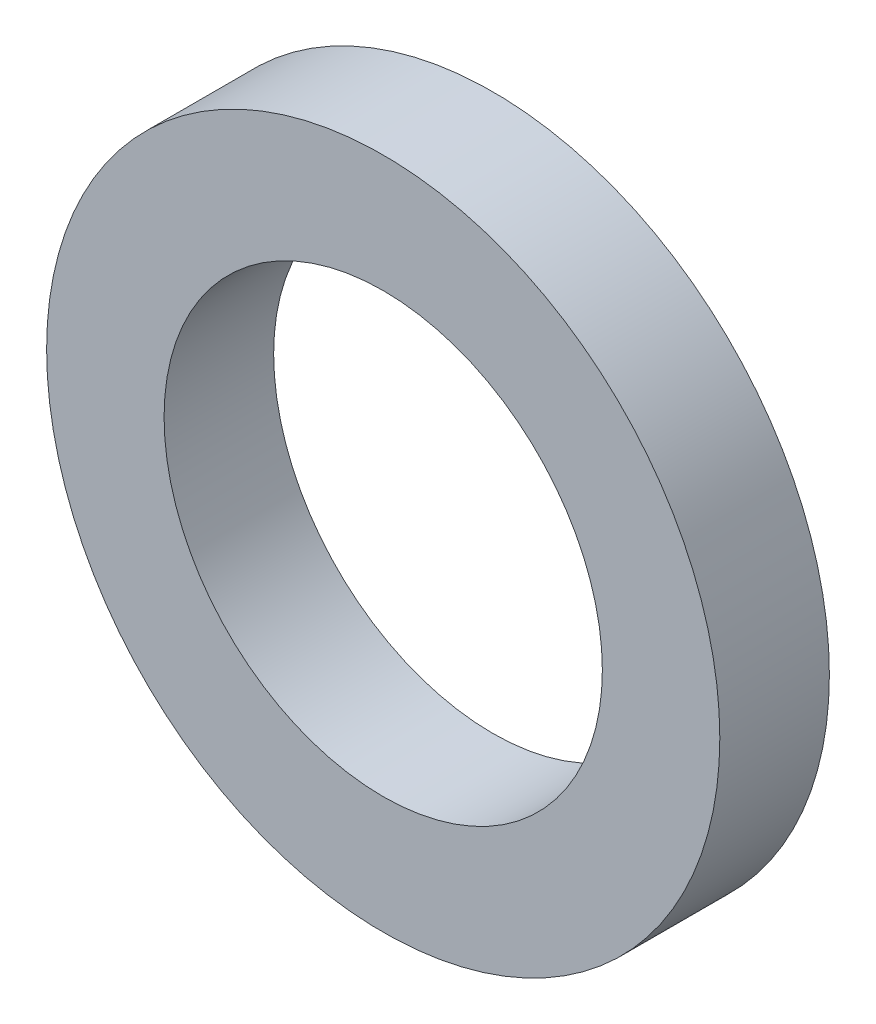
ISO-10303-21;
HEADER;
FILE_DESCRIPTION(('STEP AP214'),'2;1');
FILE_NAME('part.step','',(''),(''),'','','');
FILE_SCHEMA(('AUTOMOTIVE_DESIGN { 1 0 10303 214 1 1 1 1 }'));
ENDSEC;
DATA;
#1=APPLICATION_CONTEXT('core data for automotive mechanical design processes');
#2=APPLICATION_PROTOCOL_DEFINITION('international standard','automotive_design',2000,#1);
#3=PRODUCT_CONTEXT('',#1,'mechanical');
#4=PRODUCT('Part','Part','',(#3));
#5=PRODUCT_RELATED_PRODUCT_CATEGORY('part','',(#4));
#6=PRODUCT_DEFINITION_FORMATION('','',#4);
#7=PRODUCT_DEFINITION_CONTEXT('part definition',#1,'design');
#8=PRODUCT_DEFINITION('design','',#6,#7);
#9=PRODUCT_DEFINITION_SHAPE('','',#8);
#10=(LENGTH_UNIT() NAMED_UNIT(*) SI_UNIT(.MILLI.,.METRE.));
#11=(NAMED_UNIT(*) PLANE_ANGLE_UNIT() SI_UNIT($,.RADIAN.));
#12=(NAMED_UNIT(*) SI_UNIT($,.STERADIAN.) SOLID_ANGLE_UNIT());
#13=UNCERTAINTY_MEASURE_WITH_UNIT(LENGTH_MEASURE(1.E-05),#10,'distance_accuracy_value','');
#14=(GEOMETRIC_REPRESENTATION_CONTEXT(3) GLOBAL_UNCERTAINTY_ASSIGNED_CONTEXT((#13)) GLOBAL_UNIT_ASSIGNED_CONTEXT((#10,
#11,#12)) REPRESENTATION_CONTEXT('',''));
#15=CARTESIAN_POINT('',(0.,0.,0.));
#16=DIRECTION('',(0.,0.,1.));
#17=DIRECTION('',(1.,0.,0.));
#18=AXIS2_PLACEMENT_3D('',#15,#16,#17);
#19=CARTESIAN_POINT('',(0.,0.,3.175));
#20=DIRECTION('',(0.,0.,1.));
#21=DIRECTION('',(1.,0.,0.));
#22=AXIS2_PLACEMENT_3D('',#19,#20,#21);
#23=PLANE('',#22);
#24=CARTESIAN_POINT('',(0.,0.,3.175));
#25=DIRECTION('',(0.,0.,1.));
#26=DIRECTION('',(1.,0.,0.));
#27=AXIS2_PLACEMENT_3D('',#24,#25,#26);
#28=CIRCLE('',#27,9.7536);
#29=CARTESIAN_POINT('',(9.7536,0.,3.175));
#30=VERTEX_POINT('',#29);
#31=EDGE_CURVE('E10',#30,#30,#28,.T.);
#32=ORIENTED_EDGE('',*,*,#31,.T.);
#33=EDGE_LOOP('',(#32));
#34=FACE_BOUND('',#33,.T.);
#35=CARTESIAN_POINT('',(0.,0.,3.175));
#36=DIRECTION('',(0.,0.,1.));
#37=DIRECTION('',(1.,0.,0.));
#38=AXIS2_PLACEMENT_3D('',#35,#36,#37);
#39=CIRCLE('',#38,6.35);
#40=CARTESIAN_POINT('',(6.35,0.,3.175));
#41=VERTEX_POINT('',#40);
#42=EDGE_CURVE('E42',#41,#41,#39,.T.);
#43=ORIENTED_EDGE('',*,*,#42,.F.);
#44=EDGE_LOOP('',(#43));
#45=FACE_BOUND('',#44,.T.);
#46=ADVANCED_FACE('F31',(#34,#45),#23,.T.);
#47=CARTESIAN_POINT('',(0.,0.,0.));
#48=DIRECTION('',(0.,0.,1.));
#49=DIRECTION('',(1.,0.,0.));
#50=AXIS2_PLACEMENT_3D('',#47,#48,#49);
#51=PLANE('',#50);
#52=CARTESIAN_POINT('',(0.,0.,0.));
#53=DIRECTION('',(0.,0.,1.));
#54=DIRECTION('',(1.,0.,0.));
#55=AXIS2_PLACEMENT_3D('',#52,#53,#54);
#56=CIRCLE('',#55,9.7536);
#57=CARTESIAN_POINT('',(9.7536,0.,0.));
#58=VERTEX_POINT('',#57);
#59=EDGE_CURVE('E35',#58,#58,#56,.T.);
#60=ORIENTED_EDGE('',*,*,#59,.F.);
#61=EDGE_LOOP('',(#60));
#62=FACE_BOUND('',#61,.T.);
#63=CARTESIAN_POINT('',(0.,0.,0.));
#64=DIRECTION('',(0.,0.,1.));
#65=DIRECTION('',(1.,0.,0.));
#66=AXIS2_PLACEMENT_3D('',#63,#64,#65);
#67=CIRCLE('',#66,6.35);
#68=CARTESIAN_POINT('',(6.35,0.,0.));
#69=VERTEX_POINT('',#68);
#70=EDGE_CURVE('E44',#69,#69,#67,.T.);
#71=ORIENTED_EDGE('',*,*,#70,.T.);
#72=EDGE_LOOP('',(#71));
#73=FACE_BOUND('',#72,.T.);
#74=ADVANCED_FACE('F54',(#62,#73),#51,.F.);
#75=CARTESIAN_POINT('',(0.,0.,3.175));
#76=DIRECTION('',(0.,0.,-1.));
#77=DIRECTION('',(-1.,0.,0.));
#78=AXIS2_PLACEMENT_3D('',#75,#76,#77);
#79=CYLINDRICAL_SURFACE('',#78,9.7536);
#80=ORIENTED_EDGE('',*,*,#31,.F.);
#81=EDGE_LOOP('',(#80));
#82=FACE_BOUND('',#81,.T.);
#83=ORIENTED_EDGE('',*,*,#59,.T.);
#84=EDGE_LOOP('',(#83));
#85=FACE_BOUND('',#84,.T.);
#86=ADVANCED_FACE('F33',(#82,#85),#79,.T.);
#87=CARTESIAN_POINT('',(0.,0.,3.175));
#88=DIRECTION('',(0.,0.,-1.));
#89=DIRECTION('',(-1.,0.,0.));
#90=AXIS2_PLACEMENT_3D('',#87,#88,#89);
#91=CYLINDRICAL_SURFACE('',#90,6.35);
#92=ORIENTED_EDGE('',*,*,#42,.T.);
#93=EDGE_LOOP('',(#92));
#94=FACE_BOUND('',#93,.T.);
#95=ORIENTED_EDGE('',*,*,#70,.F.);
#96=EDGE_LOOP('',(#95));
#97=FACE_BOUND('',#96,.T.);
#98=ADVANCED_FACE('F50',(#94,#97),#91,.F.);
#99=CLOSED_SHELL('',(#46,#74,#86,#98));
#100=MANIFOLD_SOLID_BREP('B2',#99);
#101=ADVANCED_BREP_SHAPE_REPRESENTATION('',(#18,#100),#14);
#102=SHAPE_DEFINITION_REPRESENTATION(#9,#101);
ENDSEC;
END-ISO-10303-21;
